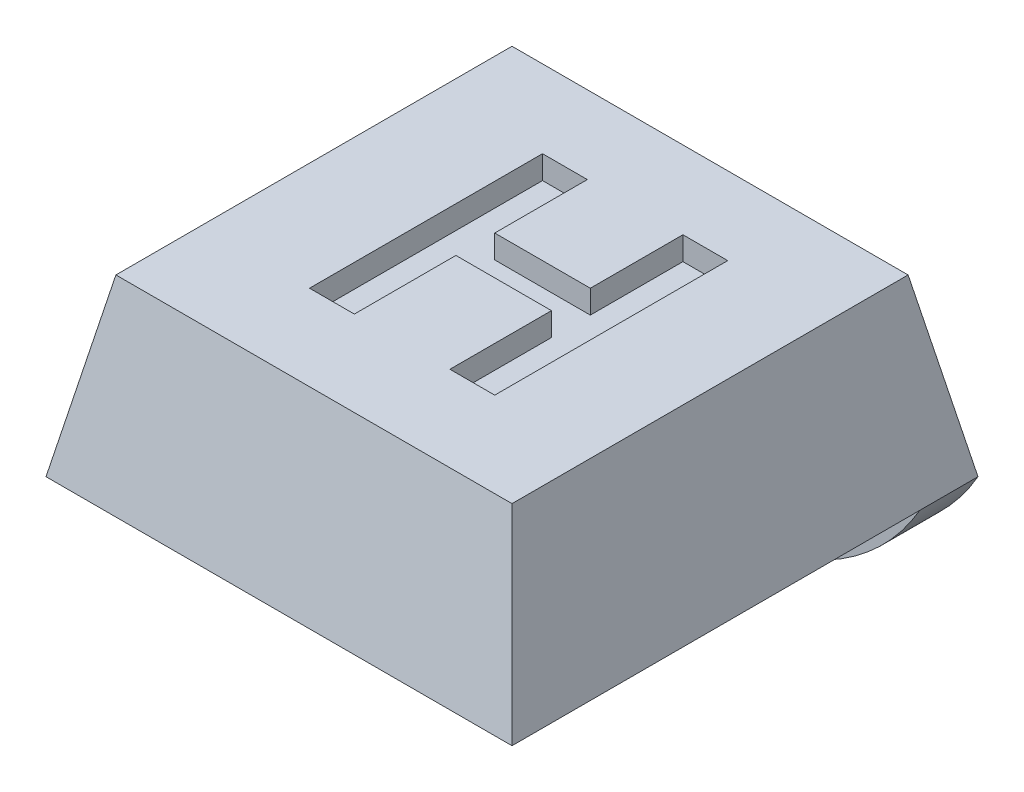
ISO-10303-21;
HEADER;
FILE_DESCRIPTION(('STEP AP214'),'2;1');
FILE_NAME('part.step','',(''),(''),'','','');
FILE_SCHEMA(('AUTOMOTIVE_DESIGN { 1 0 10303 214 1 1 1 1 }'));
ENDSEC;
DATA;
#1=APPLICATION_CONTEXT('core data for automotive mechanical design processes');
#2=APPLICATION_PROTOCOL_DEFINITION('international standard','automotive_design',2000,#1);
#3=PRODUCT_CONTEXT('',#1,'mechanical');
#4=PRODUCT('Part','Part','',(#3));
#5=PRODUCT_RELATED_PRODUCT_CATEGORY('part','',(#4));
#6=PRODUCT_DEFINITION_FORMATION('','',#4);
#7=PRODUCT_DEFINITION_CONTEXT('part definition',#1,'design');
#8=PRODUCT_DEFINITION('design','',#6,#7);
#9=PRODUCT_DEFINITION_SHAPE('','',#8);
#10=(LENGTH_UNIT() NAMED_UNIT(*) SI_UNIT(.MILLI.,.METRE.));
#11=(NAMED_UNIT(*) PLANE_ANGLE_UNIT() SI_UNIT($,.RADIAN.));
#12=(NAMED_UNIT(*) SI_UNIT($,.STERADIAN.) SOLID_ANGLE_UNIT());
#13=UNCERTAINTY_MEASURE_WITH_UNIT(LENGTH_MEASURE(1.E-05),#10,'distance_accuracy_value','');
#14=(GEOMETRIC_REPRESENTATION_CONTEXT(3) GLOBAL_UNCERTAINTY_ASSIGNED_CONTEXT((#13)) GLOBAL_UNIT_ASSIGNED_CONTEXT((#10,
#11,#12)) REPRESENTATION_CONTEXT('',''));
#15=CARTESIAN_POINT('',(0.,0.,0.));
#16=DIRECTION('',(0.,0.,1.));
#17=DIRECTION('',(1.,0.,0.));
#18=AXIS2_PLACEMENT_3D('',#15,#16,#17);
#19=CARTESIAN_POINT('',(0.,3.,0.));
#20=DIRECTION('',(0.,-1.,0.));
#21=DIRECTION('',(0.,0.,-1.));
#22=AXIS2_PLACEMENT_3D('',#19,#20,#21);
#23=PLANE('',#22);
#24=DIRECTION('',(-1.,0.,0.));
#25=VECTOR('',#24,1.);
#26=CARTESIAN_POINT('',(11.,3.,-0.6));
#27=LINE('',#26,#25);
#28=CARTESIAN_POINT('',(7.4,3.,-0.6));
#29=VERTEX_POINT('',#28);
#30=CARTESIAN_POINT('',(0.6,3.,-0.6));
#31=VERTEX_POINT('',#30);
#32=EDGE_CURVE('E229',#29,#31,#27,.T.);
#33=ORIENTED_EDGE('',*,*,#32,.F.);
#34=DIRECTION('',(0.,0.,1.));
#35=VECTOR('',#34,1.);
#36=CARTESIAN_POINT('',(7.4,3.,-8.));
#37=LINE('',#36,#35);
#38=CARTESIAN_POINT('',(7.4,3.,-7.4));
#39=VERTEX_POINT('',#38);
#40=EDGE_CURVE('E242',#39,#29,#37,.T.);
#41=ORIENTED_EDGE('',*,*,#40,.F.);
#42=DIRECTION('',(-1.,0.,0.));
#43=VECTOR('',#42,1.);
#44=CARTESIAN_POINT('',(11.,3.,-7.4));
#45=LINE('',#44,#43);
#46=CARTESIAN_POINT('',(0.599999999999999,3.,-7.4));
#47=VERTEX_POINT('',#46);
#48=EDGE_CURVE('E225',#39,#47,#45,.T.);
#49=ORIENTED_EDGE('',*,*,#48,.T.);
#50=DIRECTION('',(0.,0.,1.));
#51=VECTOR('',#50,1.);
#52=CARTESIAN_POINT('',(0.6,3.,-8.));
#53=LINE('',#52,#51);
#54=EDGE_CURVE('E245',#47,#31,#53,.T.);
#55=ORIENTED_EDGE('',*,*,#54,.T.);
#56=EDGE_LOOP('',(#33,#41,#49,#55));
#57=FACE_BOUND('',#56,.T.);
#58=DIRECTION('',(-1.,0.,0.));
#59=VECTOR('',#58,1.);
#60=CARTESIAN_POINT('',(3.22863627000197,3.,-2.06454333683485));
#61=LINE('',#60,#59);
#62=CARTESIAN_POINT('',(3.22863627000197,3.,-2.06454333683485));
#63=VERTEX_POINT('',#62);
#64=CARTESIAN_POINT('',(2.4594055007712,3.,-2.06454333683485));
#65=VERTEX_POINT('',#64);
#66=EDGE_CURVE('E58',#63,#65,#61,.T.);
#67=ORIENTED_EDGE('',*,*,#66,.T.);
#68=DIRECTION('',(0.,0.,-1.));
#69=VECTOR('',#68,1.);
#70=CARTESIAN_POINT('',(2.4594055007712,3.,-2.06454333683485));
#71=LINE('',#70,#69);
#72=CARTESIAN_POINT('',(2.4594055007712,3.,-6.06454333683485));
#73=VERTEX_POINT('',#72);
#74=EDGE_CURVE('E197',#65,#73,#71,.T.);
#75=ORIENTED_EDGE('',*,*,#74,.T.);
#76=DIRECTION('',(1.,0.,0.));
#77=VECTOR('',#76,1.);
#78=CARTESIAN_POINT('',(2.4594055007712,3.,-6.06454333683485));
#79=LINE('',#78,#77);
#80=CARTESIAN_POINT('',(3.22863627000197,3.,-6.06454333683485));
#81=VERTEX_POINT('',#80);
#82=EDGE_CURVE('E666',#73,#81,#79,.T.);
#83=ORIENTED_EDGE('',*,*,#82,.T.);
#84=DIRECTION('',(0.,0.,1.));
#85=VECTOR('',#84,1.);
#86=CARTESIAN_POINT('',(3.22863627000197,3.,-6.06454333683485));
#87=LINE('',#86,#85);
#88=CARTESIAN_POINT('',(3.22863627000197,3.,-4.47479974709126));
#89=VERTEX_POINT('',#88);
#90=EDGE_CURVE('E668',#81,#89,#87,.T.);
#91=ORIENTED_EDGE('',*,*,#90,.T.);
#92=DIRECTION('',(1.,0.,0.));
#93=VECTOR('',#92,1.);
#94=CARTESIAN_POINT('',(3.22863627000197,3.,-4.47479974709126));
#95=LINE('',#94,#93);
#96=CARTESIAN_POINT('',(4.86966191102761,3.,-4.47479974709126));
#97=VERTEX_POINT('',#96);
#98=EDGE_CURVE('E673',#89,#97,#95,.T.);
#99=ORIENTED_EDGE('',*,*,#98,.T.);
#100=DIRECTION('',(0.,0.,-1.));
#101=VECTOR('',#100,1.);
#102=CARTESIAN_POINT('',(4.86966191102761,3.,-4.47479974709126));
#103=LINE('',#102,#101);
#104=CARTESIAN_POINT('',(4.86966191102761,3.,-6.06454333683485));
#105=VERTEX_POINT('',#104);
#106=EDGE_CURVE('E683',#97,#105,#103,.T.);
#107=ORIENTED_EDGE('',*,*,#106,.T.);
#108=DIRECTION('',(1.,0.,0.));
#109=VECTOR('',#108,1.);
#110=CARTESIAN_POINT('',(4.86966191102761,3.,-6.06454333683485));
#111=LINE('',#110,#109);
#112=CARTESIAN_POINT('',(5.63889268025838,3.,-6.06454333683485));
#113=VERTEX_POINT('',#112);
#114=EDGE_CURVE('E687',#105,#113,#111,.T.);
#115=ORIENTED_EDGE('',*,*,#114,.T.);
#116=DIRECTION('',(0.,0.,1.));
#117=VECTOR('',#116,1.);
#118=CARTESIAN_POINT('',(5.63889268025838,3.,-6.06454333683485));
#119=LINE('',#118,#117);
#120=CARTESIAN_POINT('',(5.63889268025838,3.,-2.06454333683485));
#121=VERTEX_POINT('',#120);
#122=EDGE_CURVE('E691',#113,#121,#119,.T.);
#123=ORIENTED_EDGE('',*,*,#122,.T.);
#124=DIRECTION('',(-1.,0.,0.));
#125=VECTOR('',#124,1.);
#126=CARTESIAN_POINT('',(5.63889268025838,3.,-2.06454333683485));
#127=LINE('',#126,#125);
#128=CARTESIAN_POINT('',(4.86966191102761,3.,-2.06454333683485));
#129=VERTEX_POINT('',#128);
#130=EDGE_CURVE('E632',#121,#129,#127,.T.);
#131=ORIENTED_EDGE('',*,*,#130,.T.);
#132=DIRECTION('',(0.,0.,-1.));
#133=VECTOR('',#132,1.);
#134=CARTESIAN_POINT('',(4.86966191102761,3.,-2.06454333683485));
#135=LINE('',#134,#133);
#136=CARTESIAN_POINT('',(4.86966191102761,3.,-3.80813308042459));
#137=VERTEX_POINT('',#136);
#138=EDGE_CURVE('E627',#129,#137,#135,.T.);
#139=ORIENTED_EDGE('',*,*,#138,.T.);
#140=DIRECTION('',(-1.,0.,0.));
#141=VECTOR('',#140,1.);
#142=CARTESIAN_POINT('',(4.86966191102761,3.,-3.80813308042459));
#143=LINE('',#142,#141);
#144=CARTESIAN_POINT('',(3.22863627000197,3.,-3.80813308042459));
#145=VERTEX_POINT('',#144);
#146=EDGE_CURVE('E621',#137,#145,#143,.T.);
#147=ORIENTED_EDGE('',*,*,#146,.T.);
#148=DIRECTION('',(0.,0.,1.));
#149=VECTOR('',#148,1.);
#150=CARTESIAN_POINT('',(3.22863627000197,3.,-3.80813308042459));
#151=LINE('',#150,#149);
#152=EDGE_CURVE('E193',#145,#63,#151,.T.);
#153=ORIENTED_EDGE('',*,*,#152,.T.);
#154=EDGE_LOOP('',(#67,#75,#83,#91,#99,#107,#115,#123,#131,#139,#147,#153));
#155=FACE_BOUND('',#154,.T.);
#156=ADVANCED_FACE('F42',(#57,#155),#23,.F.);
#157=CARTESIAN_POINT('',(8.,0.,-8.));
#158=DIRECTION('',(-0.98058067569092,-0.196116135138184,0.));
#159=DIRECTION('',(0.196116135138184,-0.98058067569092,0.));
#160=AXIS2_PLACEMENT_3D('',#157,#158,#159);
#161=PLANE('',#160);
#162=DIRECTION('',(-0.192450089729875,0.962250448649376,-0.192450089729875));
#163=VECTOR('',#162,1.);
#164=CARTESIAN_POINT('',(7.7037037037037,1.48148148148148,-0.296296296296296));
#165=LINE('',#164,#163);
#166=CARTESIAN_POINT('',(8.,0.,0.));
#167=VERTEX_POINT('',#166);
#168=EDGE_CURVE('E239',#167,#29,#165,.T.);
#169=ORIENTED_EDGE('',*,*,#168,.F.);
#170=DIRECTION('',(0.,0.,-1.));
#171=VECTOR('',#170,1.);
#172=CARTESIAN_POINT('',(8.,0.,0.));
#173=LINE('',#172,#171);
#174=CARTESIAN_POINT('',(8.,0.,-7.));
#175=VERTEX_POINT('',#174);
#176=EDGE_CURVE('E258',#167,#175,#173,.T.);
#177=ORIENTED_EDGE('',*,*,#176,.T.);
#178=DIRECTION('',(0.,0.,1.));
#179=VECTOR('',#178,1.);
#180=CARTESIAN_POINT('',(8.,0.,-8.));
#181=LINE('',#180,#179);
#182=CARTESIAN_POINT('',(8.,0.,-8.));
#183=VERTEX_POINT('',#182);
#184=EDGE_CURVE('E199',#183,#175,#181,.T.);
#185=ORIENTED_EDGE('',*,*,#184,.F.);
#186=DIRECTION('',(0.192450089729875,-0.962250448649376,-0.192450089729875));
#187=VECTOR('',#186,1.);
#188=CARTESIAN_POINT('',(8.,0.,-8.));
#189=LINE('',#188,#187);
#190=EDGE_CURVE('E232',#39,#183,#189,.T.);
#191=ORIENTED_EDGE('',*,*,#190,.F.);
#192=ORIENTED_EDGE('',*,*,#40,.T.);
#193=EDGE_LOOP('',(#169,#177,#185,#191,#192));
#194=FACE_BOUND('',#193,.T.);
#195=ADVANCED_FACE('F326',(#194),#161,.F.);
#196=CARTESIAN_POINT('',(0.,0.,-8.));
#197=DIRECTION('',(0.98058067569092,-0.196116135138184,0.));
#198=DIRECTION('',(0.196116135138184,0.98058067569092,0.));
#199=AXIS2_PLACEMENT_3D('',#196,#197,#198);
#200=PLANE('',#199);
#201=DIRECTION('',(-0.192450089729875,-0.962250448649376,0.192450089729875));
#202=VECTOR('',#201,1.);
#203=CARTESIAN_POINT('',(0.296296296296296,1.48148148148148,-0.296296296296296));
#204=LINE('',#203,#202);
#205=CARTESIAN_POINT('',(0.,0.,0.));
#206=VERTEX_POINT('',#205);
#207=EDGE_CURVE('E286',#31,#206,#204,.T.);
#208=ORIENTED_EDGE('',*,*,#207,.F.);
#209=ORIENTED_EDGE('',*,*,#54,.F.);
#210=DIRECTION('',(0.192450089729875,0.962250448649376,0.192450089729875));
#211=VECTOR('',#210,1.);
#212=CARTESIAN_POINT('',(0.,0.,-8.));
#213=LINE('',#212,#211);
#214=CARTESIAN_POINT('',(0.,0.,-8.));
#215=VERTEX_POINT('',#214);
#216=EDGE_CURVE('E257',#215,#47,#213,.T.);
#217=ORIENTED_EDGE('',*,*,#216,.F.);
#218=DIRECTION('',(0.,0.,1.));
#219=VECTOR('',#218,1.);
#220=CARTESIAN_POINT('',(0.,0.,0.));
#221=LINE('',#220,#219);
#222=CARTESIAN_POINT('',(0.,0.,-7.));
#223=VERTEX_POINT('',#222);
#224=EDGE_CURVE('E262',#215,#223,#221,.T.);
#225=ORIENTED_EDGE('',*,*,#224,.T.);
#226=EDGE_CURVE('E249',#223,#206,#221,.T.);
#227=ORIENTED_EDGE('',*,*,#226,.T.);
#228=EDGE_LOOP('',(#208,#209,#217,#225,#227));
#229=FACE_BOUND('',#228,.T.);
#230=ADVANCED_FACE('F310',(#229),#200,.F.);
#231=CARTESIAN_POINT('',(0.,0.,0.));
#232=DIRECTION('',(0.,-1.,0.));
#233=DIRECTION('',(0.,0.,-1.));
#234=AXIS2_PLACEMENT_3D('',#231,#232,#233);
#235=PLANE('',#234);
#236=DIRECTION('',(-1.,0.,0.));
#237=VECTOR('',#236,1.);
#238=CARTESIAN_POINT('',(0.,0.,-7.));
#239=LINE('',#238,#237);
#240=EDGE_CURVE('E205',#175,#223,#239,.T.);
#241=ORIENTED_EDGE('',*,*,#240,.F.);
#242=ORIENTED_EDGE('',*,*,#176,.F.);
#243=DIRECTION('',(1.,0.,0.));
#244=VECTOR('',#243,1.);
#245=CARTESIAN_POINT('',(0.,0.,0.));
#246=LINE('',#245,#244);
#247=EDGE_CURVE('E259',#206,#167,#246,.T.);
#248=ORIENTED_EDGE('',*,*,#247,.F.);
#249=ORIENTED_EDGE('',*,*,#226,.F.);
#250=EDGE_LOOP('',(#241,#242,#248,#249));
#251=FACE_BOUND('',#250,.T.);
#252=CARTESIAN_POINT('',(4.,0.,-3.75));
#253=DIRECTION('',(0.,-1.,0.));
#254=DIRECTION('',(0.,0.,-1.));
#255=AXIS2_PLACEMENT_3D('',#252,#253,#254);
#256=CIRCLE('',#255,1.8);
#257=CARTESIAN_POINT('',(4.,0.,-5.55));
#258=VERTEX_POINT('',#257);
#259=EDGE_CURVE('E217',#258,#258,#256,.T.);
#260=ORIENTED_EDGE('',*,*,#259,.F.);
#261=EDGE_LOOP('',(#260));
#262=FACE_BOUND('',#261,.T.);
#263=ADVANCED_FACE('F321',(#251,#262),#235,.T.);
#264=CARTESIAN_POINT('',(11.,3.,-7.4));
#265=DIRECTION('',(0.,0.196116135138184,-0.98058067569092));
#266=DIRECTION('',(0.,0.98058067569092,0.196116135138184));
#267=AXIS2_PLACEMENT_3D('',#264,#265,#266);
#268=PLANE('',#267);
#269=ORIENTED_EDGE('',*,*,#190,.T.);
#270=DIRECTION('',(-1.,0.,0.));
#271=VECTOR('',#270,1.);
#272=CARTESIAN_POINT('',(0.,0.,-8.));
#273=LINE('',#272,#271);
#274=EDGE_CURVE('E253',#183,#215,#273,.T.);
#275=ORIENTED_EDGE('',*,*,#274,.T.);
#276=ORIENTED_EDGE('',*,*,#216,.T.);
#277=ORIENTED_EDGE('',*,*,#48,.F.);
#278=EDGE_LOOP('',(#269,#275,#276,#277));
#279=FACE_BOUND('',#278,.T.);
#280=ADVANCED_FACE('F305',(#279),#268,.T.);
#281=CARTESIAN_POINT('',(11.,0.,0.));
#282=DIRECTION('',(0.,0.196116135138184,0.98058067569092));
#283=DIRECTION('',(0.,-0.98058067569092,0.196116135138184));
#284=AXIS2_PLACEMENT_3D('',#281,#282,#283);
#285=PLANE('',#284);
#286=ORIENTED_EDGE('',*,*,#168,.T.);
#287=ORIENTED_EDGE('',*,*,#32,.T.);
#288=ORIENTED_EDGE('',*,*,#207,.T.);
#289=ORIENTED_EDGE('',*,*,#247,.T.);
#290=EDGE_LOOP('',(#286,#287,#288,#289));
#291=FACE_BOUND('',#290,.T.);
#292=ADVANCED_FACE('F352',(#291),#285,.T.);
#293=CARTESIAN_POINT('',(4.,0.8,-3.75));
#294=DIRECTION('',(0.,-1.,0.));
#295=DIRECTION('',(0.,0.,-1.));
#296=AXIS2_PLACEMENT_3D('',#293,#294,#295);
#297=CYLINDRICAL_SURFACE('',#296,1.8);
#298=CARTESIAN_POINT('',(4.,0.8,-3.75));
#299=DIRECTION('',(0.,-1.,0.));
#300=DIRECTION('',(0.,0.,-1.));
#301=AXIS2_PLACEMENT_3D('',#298,#299,#300);
#302=CIRCLE('',#301,1.8);
#303=CARTESIAN_POINT('',(4.,0.8,-5.55));
#304=VERTEX_POINT('',#303);
#305=EDGE_CURVE('E221',#304,#304,#302,.T.);
#306=ORIENTED_EDGE('',*,*,#305,.F.);
#307=EDGE_LOOP('',(#306));
#308=FACE_BOUND('',#307,.T.);
#309=ORIENTED_EDGE('',*,*,#259,.T.);
#310=EDGE_LOOP('',(#309));
#311=FACE_BOUND('',#310,.T.);
#312=ADVANCED_FACE('F359',(#308,#311),#297,.F.);
#313=CARTESIAN_POINT('',(4.,0.8,-3.75));
#314=DIRECTION('',(0.,-1.,0.));
#315=DIRECTION('',(0.,0.,-1.));
#316=AXIS2_PLACEMENT_3D('',#313,#314,#315);
#317=PLANE('',#316);
#318=ORIENTED_EDGE('',*,*,#305,.T.);
#319=EDGE_LOOP('',(#318));
#320=FACE_BOUND('',#319,.T.);
#321=ADVANCED_FACE('F363',(#320),#317,.T.);
#322=CARTESIAN_POINT('',(0.,-2.,-8.));
#323=DIRECTION('',(0.,0.,1.));
#324=DIRECTION('',(1.,0.,0.));
#325=AXIS2_PLACEMENT_3D('',#322,#323,#324);
#326=PLANE('',#325);
#327=ORIENTED_EDGE('',*,*,#274,.F.);
#328=CARTESIAN_POINT('',(4.53589838486225,2.,-8.));
#329=DIRECTION('',(0.,0.,1.));
#330=DIRECTION('',(1.,0.,0.));
#331=AXIS2_PLACEMENT_3D('',#328,#329,#330);
#332=CIRCLE('',#331,4.);
#333=CARTESIAN_POINT('',(4.53589838486225,-2.,-8.));
#334=VERTEX_POINT('',#333);
#335=EDGE_CURVE('E11',#183,#334,#332,.F.);
#336=ORIENTED_EDGE('',*,*,#335,.T.);
#337=DIRECTION('',(1.,0.,0.));
#338=VECTOR('',#337,1.);
#339=CARTESIAN_POINT('',(0.,-2.,-8.));
#340=LINE('',#339,#338);
#341=CARTESIAN_POINT('',(3.46410161513775,-2.,-8.));
#342=VERTEX_POINT('',#341);
#343=EDGE_CURVE('E211',#342,#334,#340,.T.);
#344=ORIENTED_EDGE('',*,*,#343,.F.);
#345=CARTESIAN_POINT('',(3.46410161513775,2.,-8.));
#346=DIRECTION('',(0.,0.,1.));
#347=DIRECTION('',(1.,0.,0.));
#348=AXIS2_PLACEMENT_3D('',#345,#346,#347);
#349=CIRCLE('',#348,4.);
#350=EDGE_CURVE('E51',#342,#215,#349,.F.);
#351=ORIENTED_EDGE('',*,*,#350,.T.);
#352=EDGE_LOOP('',(#327,#336,#344,#351));
#353=FACE_BOUND('',#352,.T.);
#354=ADVANCED_FACE('F298',(#353),#326,.F.);
#355=CARTESIAN_POINT('',(0.,-2.,-7.));
#356=DIRECTION('',(0.,0.,-1.));
#357=DIRECTION('',(-1.,0.,0.));
#358=AXIS2_PLACEMENT_3D('',#355,#356,#357);
#359=PLANE('',#358);
#360=DIRECTION('',(-1.,0.,0.));
#361=VECTOR('',#360,1.);
#362=CARTESIAN_POINT('',(0.,-2.,-7.));
#363=LINE('',#362,#361);
#364=CARTESIAN_POINT('',(4.53589838486225,-2.,-7.));
#365=VERTEX_POINT('',#364);
#366=CARTESIAN_POINT('',(3.46410161513775,-2.,-7.));
#367=VERTEX_POINT('',#366);
#368=EDGE_CURVE('E215',#365,#367,#363,.T.);
#369=ORIENTED_EDGE('',*,*,#368,.F.);
#370=CARTESIAN_POINT('',(4.53589838486225,2.,-7.));
#371=DIRECTION('',(0.,0.,-1.));
#372=DIRECTION('',(-1.,0.,0.));
#373=AXIS2_PLACEMENT_3D('',#370,#371,#372);
#374=CIRCLE('',#373,4.);
#375=EDGE_CURVE('E292',#365,#175,#374,.F.);
#376=ORIENTED_EDGE('',*,*,#375,.T.);
#377=ORIENTED_EDGE('',*,*,#240,.T.);
#378=CARTESIAN_POINT('',(3.46410161513775,2.,-7.));
#379=DIRECTION('',(0.,0.,-1.));
#380=DIRECTION('',(-1.,0.,0.));
#381=AXIS2_PLACEMENT_3D('',#378,#379,#380);
#382=CIRCLE('',#381,4.);
#383=EDGE_CURVE('E66',#223,#367,#382,.F.);
#384=ORIENTED_EDGE('',*,*,#383,.T.);
#385=EDGE_LOOP('',(#369,#376,#377,#384));
#386=FACE_BOUND('',#385,.T.);
#387=ADVANCED_FACE('F316',(#386),#359,.F.);
#388=CARTESIAN_POINT('',(0.,-2.,0.));
#389=DIRECTION('',(0.,1.,0.));
#390=DIRECTION('',(0.,0.,1.));
#391=AXIS2_PLACEMENT_3D('',#388,#389,#390);
#392=PLANE('',#391);
#393=ORIENTED_EDGE('',*,*,#343,.T.);
#394=DIRECTION('',(0.,0.,1.));
#395=VECTOR('',#394,1.);
#396=CARTESIAN_POINT('',(4.53589838486225,-2.,0.));
#397=LINE('',#396,#395);
#398=EDGE_CURVE('E285',#334,#365,#397,.T.);
#399=ORIENTED_EDGE('',*,*,#398,.T.);
#400=ORIENTED_EDGE('',*,*,#368,.T.);
#401=DIRECTION('',(0.,0.,-1.));
#402=VECTOR('',#401,1.);
#403=CARTESIAN_POINT('',(3.46410161513775,-2.,0.));
#404=LINE('',#403,#402);
#405=EDGE_CURVE('E281',#367,#342,#404,.T.);
#406=ORIENTED_EDGE('',*,*,#405,.T.);
#407=EDGE_LOOP('',(#393,#399,#400,#406));
#408=FACE_BOUND('',#407,.T.);
#409=ADVANCED_FACE('F314',(#408),#392,.F.);
#410=CARTESIAN_POINT('',(4.53589838486225,2.,-8.));
#411=DIRECTION('',(0.,0.,1.));
#412=DIRECTION('',(1.,0.,0.));
#413=AXIS2_PLACEMENT_3D('',#410,#411,#412);
#414=CYLINDRICAL_SURFACE('',#413,4.);
#415=ORIENTED_EDGE('',*,*,#335,.F.);
#416=ORIENTED_EDGE('',*,*,#184,.T.);
#417=ORIENTED_EDGE('',*,*,#375,.F.);
#418=ORIENTED_EDGE('',*,*,#398,.F.);
#419=EDGE_LOOP('',(#415,#416,#417,#418));
#420=FACE_BOUND('',#419,.T.);
#421=ADVANCED_FACE('F327',(#420),#414,.T.);
#422=CARTESIAN_POINT('',(3.46410161513775,2.,-8.));
#423=DIRECTION('',(0.,0.,-1.));
#424=DIRECTION('',(-1.,0.,0.));
#425=AXIS2_PLACEMENT_3D('',#422,#423,#424);
#426=CYLINDRICAL_SURFACE('',#425,4.);
#427=ORIENTED_EDGE('',*,*,#383,.F.);
#428=ORIENTED_EDGE('',*,*,#224,.F.);
#429=ORIENTED_EDGE('',*,*,#350,.F.);
#430=ORIENTED_EDGE('',*,*,#405,.F.);
#431=EDGE_LOOP('',(#427,#428,#429,#430));
#432=FACE_BOUND('',#431,.T.);
#433=ADVANCED_FACE('F44',(#432),#426,.T.);
#434=CARTESIAN_POINT('',(3.22863627000197,2.6,-2.06454333683485));
#435=DIRECTION('',(0.,0.,-1.));
#436=DIRECTION('',(-1.,0.,0.));
#437=AXIS2_PLACEMENT_3D('',#434,#435,#436);
#438=PLANE('',#437);
#439=ORIENTED_EDGE('',*,*,#66,.F.);
#440=DIRECTION('',(0.,1.,0.));
#441=VECTOR('',#440,1.);
#442=CARTESIAN_POINT('',(3.22863627000197,2.6,-2.06454333683485));
#443=LINE('',#442,#441);
#444=CARTESIAN_POINT('',(3.22863627000197,2.6,-2.06454333683485));
#445=VERTEX_POINT('',#444);
#446=EDGE_CURVE('E191',#445,#63,#443,.T.);
#447=ORIENTED_EDGE('',*,*,#446,.F.);
#448=DIRECTION('',(-1.,0.,0.));
#449=VECTOR('',#448,1.);
#450=CARTESIAN_POINT('',(3.22863627000197,2.6,-2.06454333683485));
#451=LINE('',#450,#449);
#452=CARTESIAN_POINT('',(2.4594055007712,2.6,-2.06454333683485));
#453=VERTEX_POINT('',#452);
#454=EDGE_CURVE('E181',#445,#453,#451,.T.);
#455=ORIENTED_EDGE('',*,*,#454,.T.);
#456=DIRECTION('',(0.,1.,0.));
#457=VECTOR('',#456,1.);
#458=CARTESIAN_POINT('',(2.4594055007712,2.6,-2.06454333683485));
#459=LINE('',#458,#457);
#460=EDGE_CURVE('E190',#453,#65,#459,.T.);
#461=ORIENTED_EDGE('',*,*,#460,.T.);
#462=EDGE_LOOP('',(#439,#447,#455,#461));
#463=FACE_BOUND('',#462,.T.);
#464=ADVANCED_FACE('F189',(#463),#438,.T.);
#465=CARTESIAN_POINT('',(2.4594055007712,2.6,-2.06454333683485));
#466=DIRECTION('',(1.,0.,0.));
#467=DIRECTION('',(0.,0.,-1.));
#468=AXIS2_PLACEMENT_3D('',#465,#466,#467);
#469=PLANE('',#468);
#470=ORIENTED_EDGE('',*,*,#74,.F.);
#471=ORIENTED_EDGE('',*,*,#460,.F.);
#472=DIRECTION('',(0.,0.,-1.));
#473=VECTOR('',#472,1.);
#474=CARTESIAN_POINT('',(2.4594055007712,2.6,-2.06454333683485));
#475=LINE('',#474,#473);
#476=CARTESIAN_POINT('',(2.4594055007712,2.6,-6.06454333683485));
#477=VERTEX_POINT('',#476);
#478=EDGE_CURVE('E177',#453,#477,#475,.T.);
#479=ORIENTED_EDGE('',*,*,#478,.T.);
#480=DIRECTION('',(0.,1.,0.));
#481=VECTOR('',#480,1.);
#482=CARTESIAN_POINT('',(2.4594055007712,2.6,-6.06454333683485));
#483=LINE('',#482,#481);
#484=EDGE_CURVE('E200',#477,#73,#483,.T.);
#485=ORIENTED_EDGE('',*,*,#484,.T.);
#486=EDGE_LOOP('',(#470,#471,#479,#485));
#487=FACE_BOUND('',#486,.T.);
#488=ADVANCED_FACE('F195',(#487),#469,.T.);
#489=CARTESIAN_POINT('',(2.4594055007712,2.6,-6.06454333683485));
#490=DIRECTION('',(0.,0.,1.));
#491=DIRECTION('',(1.,0.,0.));
#492=AXIS2_PLACEMENT_3D('',#489,#490,#491);
#493=PLANE('',#492);
#494=ORIENTED_EDGE('',*,*,#82,.F.);
#495=ORIENTED_EDGE('',*,*,#484,.F.);
#496=DIRECTION('',(1.,0.,0.));
#497=VECTOR('',#496,1.);
#498=CARTESIAN_POINT('',(2.4594055007712,2.6,-6.06454333683485));
#499=LINE('',#498,#497);
#500=CARTESIAN_POINT('',(3.22863627000197,2.6,-6.06454333683485));
#501=VERTEX_POINT('',#500);
#502=EDGE_CURVE('E183',#477,#501,#499,.T.);
#503=ORIENTED_EDGE('',*,*,#502,.T.);
#504=DIRECTION('',(0.,1.,0.));
#505=VECTOR('',#504,1.);
#506=CARTESIAN_POINT('',(3.22863627000197,2.6,-6.06454333683485));
#507=LINE('',#506,#505);
#508=EDGE_CURVE('E207',#501,#81,#507,.T.);
#509=ORIENTED_EDGE('',*,*,#508,.T.);
#510=EDGE_LOOP('',(#494,#495,#503,#509));
#511=FACE_BOUND('',#510,.T.);
#512=ADVANCED_FACE('F376',(#511),#493,.T.);
#513=CARTESIAN_POINT('',(3.22863627000197,2.6,-6.06454333683485));
#514=DIRECTION('',(-1.,0.,0.));
#515=DIRECTION('',(0.,0.,1.));
#516=AXIS2_PLACEMENT_3D('',#513,#514,#515);
#517=PLANE('',#516);
#518=ORIENTED_EDGE('',*,*,#90,.F.);
#519=ORIENTED_EDGE('',*,*,#508,.F.);
#520=DIRECTION('',(0.,0.,1.));
#521=VECTOR('',#520,1.);
#522=CARTESIAN_POINT('',(3.22863627000197,2.6,-6.06454333683485));
#523=LINE('',#522,#521);
#524=CARTESIAN_POINT('',(3.22863627000197,2.6,-4.47479974709126));
#525=VERTEX_POINT('',#524);
#526=EDGE_CURVE('E727',#501,#525,#523,.T.);
#527=ORIENTED_EDGE('',*,*,#526,.T.);
#528=DIRECTION('',(0.,1.,0.));
#529=VECTOR('',#528,1.);
#530=CARTESIAN_POINT('',(3.22863627000197,2.6,-4.47479974709126));
#531=LINE('',#530,#529);
#532=EDGE_CURVE('E659',#525,#89,#531,.T.);
#533=ORIENTED_EDGE('',*,*,#532,.T.);
#534=EDGE_LOOP('',(#518,#519,#527,#533));
#535=FACE_BOUND('',#534,.T.);
#536=ADVANCED_FACE('F379',(#535),#517,.T.);
#537=CARTESIAN_POINT('',(3.22863627000197,2.6,-4.47479974709126));
#538=DIRECTION('',(0.,0.,1.));
#539=DIRECTION('',(1.,0.,0.));
#540=AXIS2_PLACEMENT_3D('',#537,#538,#539);
#541=PLANE('',#540);
#542=ORIENTED_EDGE('',*,*,#98,.F.);
#543=ORIENTED_EDGE('',*,*,#532,.F.);
#544=DIRECTION('',(1.,0.,0.));
#545=VECTOR('',#544,1.);
#546=CARTESIAN_POINT('',(3.22863627000197,2.6,-4.47479974709126));
#547=LINE('',#546,#545);
#548=CARTESIAN_POINT('',(4.86966191102761,2.6,-4.47479974709126));
#549=VERTEX_POINT('',#548);
#550=EDGE_CURVE('E724',#525,#549,#547,.T.);
#551=ORIENTED_EDGE('',*,*,#550,.T.);
#552=DIRECTION('',(0.,1.,0.));
#553=VECTOR('',#552,1.);
#554=CARTESIAN_POINT('',(4.86966191102761,2.6,-4.47479974709126));
#555=LINE('',#554,#553);
#556=EDGE_CURVE('E656',#549,#97,#555,.T.);
#557=ORIENTED_EDGE('',*,*,#556,.T.);
#558=EDGE_LOOP('',(#542,#543,#551,#557));
#559=FACE_BOUND('',#558,.T.);
#560=ADVANCED_FACE('F383',(#559),#541,.T.);
#561=CARTESIAN_POINT('',(4.86966191102761,2.6,-4.47479974709126));
#562=DIRECTION('',(1.,0.,0.));
#563=DIRECTION('',(0.,0.,-1.));
#564=AXIS2_PLACEMENT_3D('',#561,#562,#563);
#565=PLANE('',#564);
#566=ORIENTED_EDGE('',*,*,#106,.F.);
#567=ORIENTED_EDGE('',*,*,#556,.F.);
#568=DIRECTION('',(0.,0.,-1.));
#569=VECTOR('',#568,1.);
#570=CARTESIAN_POINT('',(4.86966191102761,2.6,-4.47479974709126));
#571=LINE('',#570,#569);
#572=CARTESIAN_POINT('',(4.86966191102761,2.6,-6.06454333683485));
#573=VERTEX_POINT('',#572);
#574=EDGE_CURVE('E721',#549,#573,#571,.T.);
#575=ORIENTED_EDGE('',*,*,#574,.T.);
#576=DIRECTION('',(0.,1.,0.));
#577=VECTOR('',#576,1.);
#578=CARTESIAN_POINT('',(4.86966191102761,2.6,-6.06454333683485));
#579=LINE('',#578,#577);
#580=EDGE_CURVE('E653',#573,#105,#579,.T.);
#581=ORIENTED_EDGE('',*,*,#580,.T.);
#582=EDGE_LOOP('',(#566,#567,#575,#581));
#583=FACE_BOUND('',#582,.T.);
#584=ADVANCED_FACE('F387',(#583),#565,.T.);
#585=CARTESIAN_POINT('',(4.86966191102761,2.6,-6.06454333683485));
#586=DIRECTION('',(0.,0.,1.));
#587=DIRECTION('',(1.,0.,0.));
#588=AXIS2_PLACEMENT_3D('',#585,#586,#587);
#589=PLANE('',#588);
#590=ORIENTED_EDGE('',*,*,#114,.F.);
#591=ORIENTED_EDGE('',*,*,#580,.F.);
#592=DIRECTION('',(1.,0.,0.));
#593=VECTOR('',#592,1.);
#594=CARTESIAN_POINT('',(4.86966191102761,2.6,-6.06454333683485));
#595=LINE('',#594,#593);
#596=CARTESIAN_POINT('',(5.63889268025838,2.6,-6.06454333683485));
#597=VERTEX_POINT('',#596);
#598=EDGE_CURVE('E718',#573,#597,#595,.T.);
#599=ORIENTED_EDGE('',*,*,#598,.T.);
#600=DIRECTION('',(0.,1.,0.));
#601=VECTOR('',#600,1.);
#602=CARTESIAN_POINT('',(5.63889268025838,2.6,-6.06454333683485));
#603=LINE('',#602,#601);
#604=EDGE_CURVE('E650',#597,#113,#603,.T.);
#605=ORIENTED_EDGE('',*,*,#604,.T.);
#606=EDGE_LOOP('',(#590,#591,#599,#605));
#607=FACE_BOUND('',#606,.T.);
#608=ADVANCED_FACE('F391',(#607),#589,.T.);
#609=CARTESIAN_POINT('',(5.63889268025838,2.6,-6.06454333683485));
#610=DIRECTION('',(-1.,0.,0.));
#611=DIRECTION('',(0.,0.,1.));
#612=AXIS2_PLACEMENT_3D('',#609,#610,#611);
#613=PLANE('',#612);
#614=ORIENTED_EDGE('',*,*,#122,.F.);
#615=ORIENTED_EDGE('',*,*,#604,.F.);
#616=DIRECTION('',(0.,0.,1.));
#617=VECTOR('',#616,1.);
#618=CARTESIAN_POINT('',(5.63889268025838,2.6,-6.06454333683485));
#619=LINE('',#618,#617);
#620=CARTESIAN_POINT('',(5.63889268025838,2.6,-2.06454333683485));
#621=VERTEX_POINT('',#620);
#622=EDGE_CURVE('E715',#597,#621,#619,.T.);
#623=ORIENTED_EDGE('',*,*,#622,.T.);
#624=DIRECTION('',(0.,1.,0.));
#625=VECTOR('',#624,1.);
#626=CARTESIAN_POINT('',(5.63889268025838,2.6,-2.06454333683485));
#627=LINE('',#626,#625);
#628=EDGE_CURVE('E647',#621,#121,#627,.T.);
#629=ORIENTED_EDGE('',*,*,#628,.T.);
#630=EDGE_LOOP('',(#614,#615,#623,#629));
#631=FACE_BOUND('',#630,.T.);
#632=ADVANCED_FACE('F395',(#631),#613,.T.);
#633=CARTESIAN_POINT('',(5.63889268025838,2.6,-2.06454333683485));
#634=DIRECTION('',(0.,0.,-1.));
#635=DIRECTION('',(-1.,0.,0.));
#636=AXIS2_PLACEMENT_3D('',#633,#634,#635);
#637=PLANE('',#636);
#638=ORIENTED_EDGE('',*,*,#130,.F.);
#639=ORIENTED_EDGE('',*,*,#628,.F.);
#640=DIRECTION('',(-1.,0.,0.));
#641=VECTOR('',#640,1.);
#642=CARTESIAN_POINT('',(5.63889268025838,2.6,-2.06454333683485));
#643=LINE('',#642,#641);
#644=CARTESIAN_POINT('',(4.86966191102761,2.6,-2.06454333683485));
#645=VERTEX_POINT('',#644);
#646=EDGE_CURVE('E700',#621,#645,#643,.T.);
#647=ORIENTED_EDGE('',*,*,#646,.T.);
#648=DIRECTION('',(0.,1.,0.));
#649=VECTOR('',#648,1.);
#650=CARTESIAN_POINT('',(4.86966191102761,2.6,-2.06454333683485));
#651=LINE('',#650,#649);
#652=EDGE_CURVE('E644',#645,#129,#651,.T.);
#653=ORIENTED_EDGE('',*,*,#652,.T.);
#654=EDGE_LOOP('',(#638,#639,#647,#653));
#655=FACE_BOUND('',#654,.T.);
#656=ADVANCED_FACE('F399',(#655),#637,.T.);
#657=CARTESIAN_POINT('',(4.86966191102761,2.6,-2.06454333683485));
#658=DIRECTION('',(1.,0.,0.));
#659=DIRECTION('',(0.,0.,-1.));
#660=AXIS2_PLACEMENT_3D('',#657,#658,#659);
#661=PLANE('',#660);
#662=ORIENTED_EDGE('',*,*,#138,.F.);
#663=ORIENTED_EDGE('',*,*,#652,.F.);
#664=DIRECTION('',(0.,0.,-1.));
#665=VECTOR('',#664,1.);
#666=CARTESIAN_POINT('',(4.86966191102761,2.6,-2.06454333683485));
#667=LINE('',#666,#665);
#668=CARTESIAN_POINT('',(4.86966191102761,2.6,-3.80813308042459));
#669=VERTEX_POINT('',#668);
#670=EDGE_CURVE('E702',#645,#669,#667,.T.);
#671=ORIENTED_EDGE('',*,*,#670,.T.);
#672=DIRECTION('',(0.,1.,0.));
#673=VECTOR('',#672,1.);
#674=CARTESIAN_POINT('',(4.86966191102761,2.6,-3.80813308042459));
#675=LINE('',#674,#673);
#676=EDGE_CURVE('E641',#669,#137,#675,.T.);
#677=ORIENTED_EDGE('',*,*,#676,.T.);
#678=EDGE_LOOP('',(#662,#663,#671,#677));
#679=FACE_BOUND('',#678,.T.);
#680=ADVANCED_FACE('F403',(#679),#661,.T.);
#681=CARTESIAN_POINT('',(4.86966191102761,2.6,-3.80813308042459));
#682=DIRECTION('',(0.,0.,-1.));
#683=DIRECTION('',(-1.,0.,0.));
#684=AXIS2_PLACEMENT_3D('',#681,#682,#683);
#685=PLANE('',#684);
#686=ORIENTED_EDGE('',*,*,#146,.F.);
#687=ORIENTED_EDGE('',*,*,#676,.F.);
#688=DIRECTION('',(-1.,0.,0.));
#689=VECTOR('',#688,1.);
#690=CARTESIAN_POINT('',(4.86966191102761,2.6,-3.80813308042459));
#691=LINE('',#690,#689);
#692=CARTESIAN_POINT('',(3.22863627000197,2.6,-3.80813308042459));
#693=VERTEX_POINT('',#692);
#694=EDGE_CURVE('E704',#669,#693,#691,.T.);
#695=ORIENTED_EDGE('',*,*,#694,.T.);
#696=DIRECTION('',(0.,1.,0.));
#697=VECTOR('',#696,1.);
#698=CARTESIAN_POINT('',(3.22863627000197,2.6,-3.80813308042459));
#699=LINE('',#698,#697);
#700=EDGE_CURVE('E619',#693,#145,#699,.T.);
#701=ORIENTED_EDGE('',*,*,#700,.T.);
#702=EDGE_LOOP('',(#686,#687,#695,#701));
#703=FACE_BOUND('',#702,.T.);
#704=ADVANCED_FACE('F407',(#703),#685,.T.);
#705=CARTESIAN_POINT('',(3.22863627000197,2.6,-3.80813308042459));
#706=DIRECTION('',(-1.,0.,0.));
#707=DIRECTION('',(0.,0.,1.));
#708=AXIS2_PLACEMENT_3D('',#705,#706,#707);
#709=PLANE('',#708);
#710=ORIENTED_EDGE('',*,*,#152,.F.);
#711=ORIENTED_EDGE('',*,*,#700,.F.);
#712=DIRECTION('',(0.,0.,1.));
#713=VECTOR('',#712,1.);
#714=CARTESIAN_POINT('',(3.22863627000197,2.6,-3.80813308042459));
#715=LINE('',#714,#713);
#716=EDGE_CURVE('E638',#693,#445,#715,.T.);
#717=ORIENTED_EDGE('',*,*,#716,.T.);
#718=ORIENTED_EDGE('',*,*,#446,.T.);
#719=EDGE_LOOP('',(#710,#711,#717,#718));
#720=FACE_BOUND('',#719,.T.);
#721=ADVANCED_FACE('F411',(#720),#709,.T.);
#722=CARTESIAN_POINT('',(0.,2.6,0.));
#723=DIRECTION('',(0.,-1.,0.));
#724=DIRECTION('',(0.,0.,-1.));
#725=AXIS2_PLACEMENT_3D('',#722,#723,#724);
#726=PLANE('',#725);
#727=ORIENTED_EDGE('',*,*,#454,.F.);
#728=ORIENTED_EDGE('',*,*,#716,.F.);
#729=ORIENTED_EDGE('',*,*,#694,.F.);
#730=ORIENTED_EDGE('',*,*,#670,.F.);
#731=ORIENTED_EDGE('',*,*,#646,.F.);
#732=ORIENTED_EDGE('',*,*,#622,.F.);
#733=ORIENTED_EDGE('',*,*,#598,.F.);
#734=ORIENTED_EDGE('',*,*,#574,.F.);
#735=ORIENTED_EDGE('',*,*,#550,.F.);
#736=ORIENTED_EDGE('',*,*,#526,.F.);
#737=ORIENTED_EDGE('',*,*,#502,.F.);
#738=ORIENTED_EDGE('',*,*,#478,.F.);
#739=EDGE_LOOP('',(#727,#728,#729,#730,#731,#732,#733,#734,#735,#736,#737,#738));
#740=FACE_BOUND('',#739,.T.);
#741=ADVANCED_FACE('F179',(#740),#726,.F.);
#742=CLOSED_SHELL('',(#156,#195,#230,#263,#280,#292,#312,#321,#354,#387,#409,#421,#433,#464,
#488,#512,#536,#560,#584,#608,#632,#656,#680,#704,#721,#741));
#743=MANIFOLD_SOLID_BREP('B2',#742);
#744=ADVANCED_BREP_SHAPE_REPRESENTATION('',(#18,#743),#14);
#745=SHAPE_DEFINITION_REPRESENTATION(#9,#744);
ENDSEC;
END-ISO-10303-21;
